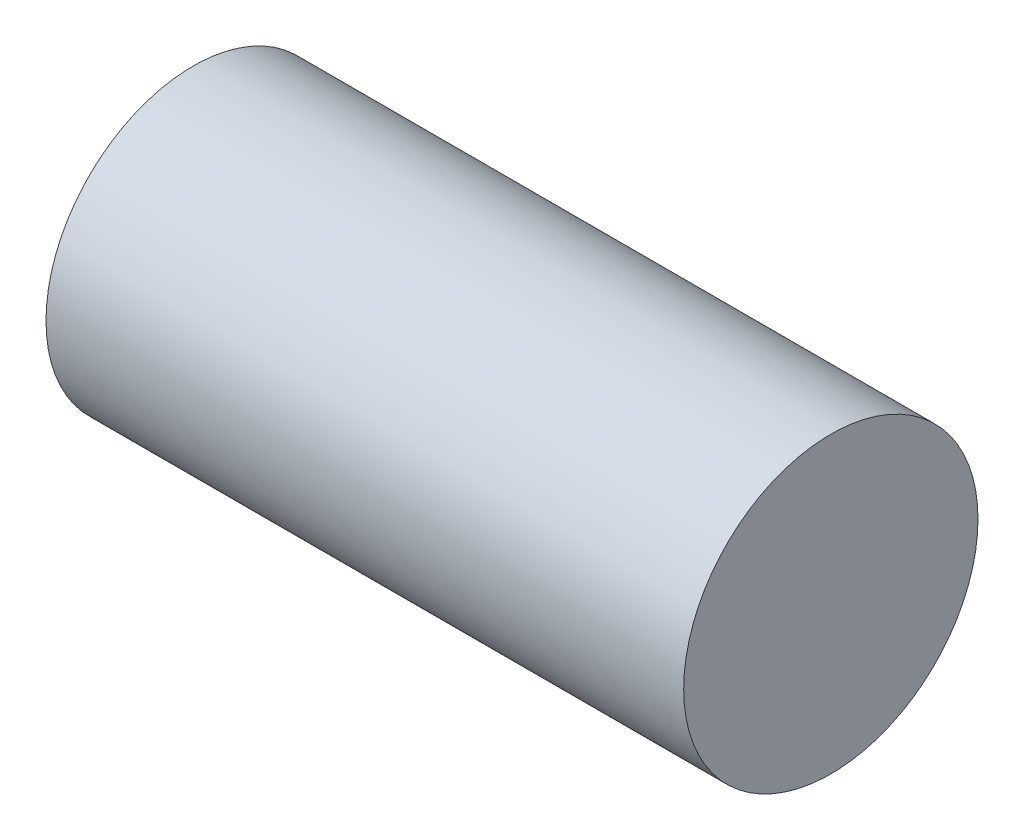
ISO-10303-21;
HEADER;
FILE_DESCRIPTION(('STEP AP214'),'2;1');
FILE_NAME('part.step','',(''),(''),'','','');
FILE_SCHEMA(('AUTOMOTIVE_DESIGN { 1 0 10303 214 1 1 1 1 }'));
ENDSEC;
DATA;
#1=APPLICATION_CONTEXT('core data for automotive mechanical design processes');
#2=APPLICATION_PROTOCOL_DEFINITION('international standard','automotive_design',2000,#1);
#3=PRODUCT_CONTEXT('',#1,'mechanical');
#4=PRODUCT('Part','Part','',(#3));
#5=PRODUCT_RELATED_PRODUCT_CATEGORY('part','',(#4));
#6=PRODUCT_DEFINITION_FORMATION('','',#4);
#7=PRODUCT_DEFINITION_CONTEXT('part definition',#1,'design');
#8=PRODUCT_DEFINITION('design','',#6,#7);
#9=PRODUCT_DEFINITION_SHAPE('','',#8);
#10=(LENGTH_UNIT() NAMED_UNIT(*) SI_UNIT(.MILLI.,.METRE.));
#11=(NAMED_UNIT(*) PLANE_ANGLE_UNIT() SI_UNIT($,.RADIAN.));
#12=(NAMED_UNIT(*) SI_UNIT($,.STERADIAN.) SOLID_ANGLE_UNIT());
#13=UNCERTAINTY_MEASURE_WITH_UNIT(LENGTH_MEASURE(1.E-05),#10,'distance_accuracy_value','');
#14=(GEOMETRIC_REPRESENTATION_CONTEXT(3) GLOBAL_UNCERTAINTY_ASSIGNED_CONTEXT((#13)) GLOBAL_UNIT_ASSIGNED_CONTEXT((#10,
#11,#12)) REPRESENTATION_CONTEXT('',''));
#15=CARTESIAN_POINT('',(0.,0.,0.));
#16=DIRECTION('',(0.,0.,1.));
#17=DIRECTION('',(1.,0.,0.));
#18=AXIS2_PLACEMENT_3D('',#15,#16,#17);
#19=CARTESIAN_POINT('',(26.,0.,0.));
#20=DIRECTION('',(-1.,0.,0.));
#21=DIRECTION('',(0.,0.,1.));
#22=AXIS2_PLACEMENT_3D('',#19,#20,#21);
#23=CYLINDRICAL_SURFACE('',#22,6.);
#24=CARTESIAN_POINT('',(26.,0.,0.));
#25=DIRECTION('',(1.,0.,0.));
#26=DIRECTION('',(0.,0.,-1.));
#27=AXIS2_PLACEMENT_3D('',#24,#25,#26);
#28=CIRCLE('',#27,6.);
#29=CARTESIAN_POINT('',(26.,0.,6.));
#30=VERTEX_POINT('',#29);
#31=EDGE_CURVE('E10',#30,#30,#28,.T.);
#32=CARTESIAN_POINT('',(0.,0.,0.));
#33=DIRECTION('',(1.,0.,0.));
#34=DIRECTION('',(0.,0.,-1.));
#35=AXIS2_PLACEMENT_3D('',#32,#33,#34);
#36=CIRCLE('',#35,6.);
#37=CARTESIAN_POINT('',(0.,0.,6.));
#38=VERTEX_POINT('',#37);
#39=EDGE_CURVE('E39',#38,#38,#36,.T.);
#40=CARTESIAN_POINT('',(26.,0.,6.));
#41=CARTESIAN_POINT('',(25.7291666666667,0.,6.));
#42=CARTESIAN_POINT('',(25.4583333333333,0.,6.));
#43=CARTESIAN_POINT('',(24.9166666666667,0.,6.));
#44=CARTESIAN_POINT('',(24.6458333333333,0.,6.));
#45=CARTESIAN_POINT('',(24.1041666666667,0.,6.));
#46=CARTESIAN_POINT('',(23.8333333333333,0.,6.));
#47=CARTESIAN_POINT('',(23.2916666666667,0.,6.));
#48=CARTESIAN_POINT('',(23.0208333333333,0.,6.));
#49=CARTESIAN_POINT('',(22.4791666666667,0.,6.));
#50=CARTESIAN_POINT('',(22.2083333333333,0.,6.));
#51=CARTESIAN_POINT('',(21.6666666666667,0.,6.));
#52=CARTESIAN_POINT('',(21.3958333333333,0.,6.));
#53=CARTESIAN_POINT('',(20.8541666666667,0.,6.));
#54=CARTESIAN_POINT('',(20.5833333333333,0.,6.));
#55=CARTESIAN_POINT('',(20.0416666666667,0.,6.));
#56=CARTESIAN_POINT('',(19.7708333333333,0.,6.));
#57=CARTESIAN_POINT('',(19.2291666666667,0.,6.));
#58=CARTESIAN_POINT('',(18.9583333333333,0.,6.));
#59=CARTESIAN_POINT('',(18.4166666666667,0.,6.));
#60=CARTESIAN_POINT('',(18.1458333333333,0.,6.));
#61=CARTESIAN_POINT('',(17.6041666666667,0.,6.));
#62=CARTESIAN_POINT('',(17.3333333333333,0.,6.));
#63=CARTESIAN_POINT('',(16.7916666666667,0.,6.));
#64=CARTESIAN_POINT('',(16.5208333333333,0.,6.));
#65=CARTESIAN_POINT('',(15.9791666666667,0.,6.));
#66=CARTESIAN_POINT('',(15.7083333333333,0.,6.));
#67=CARTESIAN_POINT('',(15.1666666666667,0.,6.));
#68=CARTESIAN_POINT('',(14.8958333333333,0.,6.));
#69=CARTESIAN_POINT('',(14.3541666666667,0.,6.));
#70=CARTESIAN_POINT('',(14.0833333333333,0.,6.));
#71=CARTESIAN_POINT('',(13.5416666666667,0.,6.));
#72=CARTESIAN_POINT('',(13.2708333333333,0.,6.));
#73=CARTESIAN_POINT('',(12.7291666666667,0.,6.));
#74=CARTESIAN_POINT('',(12.4583333333333,0.,6.));
#75=CARTESIAN_POINT('',(11.9166666666667,0.,6.));
#76=CARTESIAN_POINT('',(11.6458333333333,0.,6.));
#77=CARTESIAN_POINT('',(11.1041666666667,0.,6.));
#78=CARTESIAN_POINT('',(10.8333333333333,0.,6.));
#79=CARTESIAN_POINT('',(10.2916666666667,0.,6.));
#80=CARTESIAN_POINT('',(10.0208333333333,0.,6.));
#81=CARTESIAN_POINT('',(9.47916666666667,0.,6.));
#82=CARTESIAN_POINT('',(9.20833333333333,0.,6.));
#83=CARTESIAN_POINT('',(8.66666666666667,0.,6.));
#84=CARTESIAN_POINT('',(8.39583333333333,0.,6.));
#85=CARTESIAN_POINT('',(7.85416666666667,0.,6.));
#86=CARTESIAN_POINT('',(7.58333333333333,0.,6.));
#87=CARTESIAN_POINT('',(7.04166666666667,0.,6.));
#88=CARTESIAN_POINT('',(6.77083333333333,0.,6.));
#89=CARTESIAN_POINT('',(6.22916666666667,0.,6.));
#90=CARTESIAN_POINT('',(5.95833333333333,0.,6.));
#91=CARTESIAN_POINT('',(5.41666666666667,0.,6.));
#92=CARTESIAN_POINT('',(5.14583333333333,0.,6.));
#93=CARTESIAN_POINT('',(4.60416666666667,0.,6.));
#94=CARTESIAN_POINT('',(4.33333333333333,0.,6.));
#95=CARTESIAN_POINT('',(3.79166666666667,0.,6.));
#96=CARTESIAN_POINT('',(3.52083333333333,0.,6.));
#97=CARTESIAN_POINT('',(2.97916666666667,0.,6.));
#98=CARTESIAN_POINT('',(2.70833333333333,0.,6.));
#99=CARTESIAN_POINT('',(2.16666666666667,0.,6.));
#100=CARTESIAN_POINT('',(1.89583333333333,0.,6.));
#101=CARTESIAN_POINT('',(1.35416666666667,0.,6.));
#102=CARTESIAN_POINT('',(1.08333333333333,0.,6.));
#103=CARTESIAN_POINT('',(0.541666666666667,0.,6.));
#104=CARTESIAN_POINT('',(0.270833333333334,0.,6.));
#105=CARTESIAN_POINT('',(0.,0.,6.));
#106=B_SPLINE_CURVE_WITH_KNOTS('',3,(#40,#41,#42,#43,#44,#45,#46,#47,#48,#49,#50,#51,#52,#53,
#54,#55,#56,#57,#58,#59,#60,#61,#62,#63,#64,#65,#66,#67,#68,#69,#70,#71,#72,#73,#74,#75,#76,#77,
#78,#79,#80,#81,#82,#83,#84,#85,#86,#87,#88,#89,#90,#91,#92,#93,#94,#95,#96,#97,#98,#99,#100,
#101,#102,#103,#104,#105),.UNSPECIFIED.,.F.,.F.,(4,2,2,2,2,2,2,2,2,2,2,2,2,2,2,2,2,2,2,2,2,2,2,
2,2,2,2,2,2,2,2,2,4),(0.,0.812499999999997,1.625,2.4375,3.25,4.0625,4.875,5.6875,6.5,7.3125,
8.125,8.93749999999999,9.74999999999999,10.5625,11.375,12.1875,13.,13.8125,14.625,15.4375,16.25,
17.0625,17.875,18.6875,19.5,20.3125,21.125,21.9375,22.75,23.5625,24.375,25.1875,26.),.UNSPECIFIED.);
#107=EDGE_CURVE('BSEAM38',#30,#38,#106,.T.);
#108=ORIENTED_EDGE('',*,*,#31,.F.);
#109=ORIENTED_EDGE('',*,*,#39,.T.);
#110=ORIENTED_EDGE('',*,*,#107,.T.);
#111=ORIENTED_EDGE('',*,*,#107,.F.);
#112=EDGE_LOOP('',(#108,#110,#109,#111));
#113=FACE_BOUND('',#112,.T.);
#114=ADVANCED_FACE('F38',(#113),#23,.T.);
#115=CARTESIAN_POINT('',(26.,0.,0.));
#116=DIRECTION('',(1.,0.,0.));
#117=DIRECTION('',(0.,0.,-1.));
#118=AXIS2_PLACEMENT_3D('',#115,#116,#117);
#119=PLANE('',#118);
#120=ORIENTED_EDGE('',*,*,#31,.T.);
#121=EDGE_LOOP('',(#120));
#122=FACE_BOUND('',#121,.T.);
#123=ADVANCED_FACE('F51',(#122),#119,.T.);
#124=CARTESIAN_POINT('',(0.,0.,0.));
#125=DIRECTION('',(1.,0.,0.));
#126=DIRECTION('',(0.,0.,-1.));
#127=AXIS2_PLACEMENT_3D('',#124,#125,#126);
#128=PLANE('',#127);
#129=ORIENTED_EDGE('',*,*,#39,.F.);
#130=EDGE_LOOP('',(#129));
#131=FACE_BOUND('',#130,.T.);
#132=ADVANCED_FACE('F47',(#131),#128,.F.);
#133=CLOSED_SHELL('',(#114,#123,#132));
#134=MANIFOLD_SOLID_BREP('B2',#133);
#135=ADVANCED_BREP_SHAPE_REPRESENTATION('',(#18,#134),#14);
#136=SHAPE_DEFINITION_REPRESENTATION(#9,#135);
ENDSEC;
END-ISO-10303-21;
